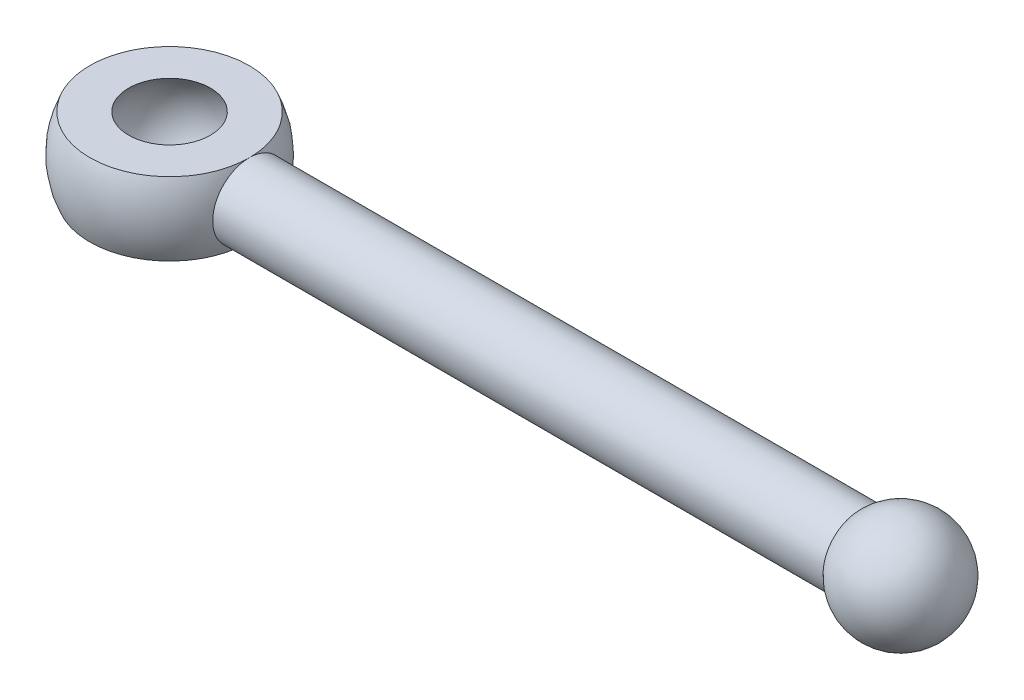
ISO-10303-21;
HEADER;
FILE_DESCRIPTION(('STEP AP214'),'2;1');
FILE_NAME('part.step','',(''),(''),'','','');
FILE_SCHEMA(('AUTOMOTIVE_DESIGN { 1 0 10303 214 1 1 1 1 }'));
ENDSEC;
DATA;
#1=APPLICATION_CONTEXT('core data for automotive mechanical design processes');
#2=APPLICATION_PROTOCOL_DEFINITION('international standard','automotive_design',2000,#1);
#3=PRODUCT_CONTEXT('',#1,'mechanical');
#4=PRODUCT('Part','Part','',(#3));
#5=PRODUCT_RELATED_PRODUCT_CATEGORY('part','',(#4));
#6=PRODUCT_DEFINITION_FORMATION('','',#4);
#7=PRODUCT_DEFINITION_CONTEXT('part definition',#1,'design');
#8=PRODUCT_DEFINITION('design','',#6,#7);
#9=PRODUCT_DEFINITION_SHAPE('','',#8);
#10=(LENGTH_UNIT() NAMED_UNIT(*) SI_UNIT(.MILLI.,.METRE.));
#11=(NAMED_UNIT(*) PLANE_ANGLE_UNIT() SI_UNIT($,.RADIAN.));
#12=(NAMED_UNIT(*) SI_UNIT($,.STERADIAN.) SOLID_ANGLE_UNIT());
#13=UNCERTAINTY_MEASURE_WITH_UNIT(LENGTH_MEASURE(1.E-05),#10,'distance_accuracy_value','');
#14=(GEOMETRIC_REPRESENTATION_CONTEXT(3) GLOBAL_UNCERTAINTY_ASSIGNED_CONTEXT((#13)) GLOBAL_UNIT_ASSIGNED_CONTEXT((#10,
#11,#12)) REPRESENTATION_CONTEXT('',''));
#15=CARTESIAN_POINT('',(0.,0.,0.));
#16=DIRECTION('',(0.,0.,1.));
#17=DIRECTION('',(1.,0.,0.));
#18=AXIS2_PLACEMENT_3D('',#15,#16,#17);
#19=CARTESIAN_POINT('',(-100.,0.,0.));
#20=DIRECTION('',(-1.,0.,0.));
#21=DIRECTION('',(0.,1.,0.));
#22=AXIS2_PLACEMENT_3D('',#19,#20,#21);
#23=SPHERICAL_SURFACE('',#22,24.);
#24=CARTESIAN_POINT('',(-78.1825757707286,0.,0.));
#25=DIRECTION('',(-1.,0.,0.));
#26=DIRECTION('',(0.,0.,1.));
#27=AXIS2_PLACEMENT_3D('',#24,#25,#26);
#28=CIRCLE('',#27,9.99999999999999);
#29=CARTESIAN_POINT('',(-78.1825757707286,-9.99999999999999,0.));
#30=VERTEX_POINT('',#29);
#31=CARTESIAN_POINT('',(-78.1825757707286,9.99999999999999,0.));
#32=VERTEX_POINT('',#31);
#33=EDGE_CURVE('E43',#30,#32,#28,.T.);
#34=ORIENTED_EDGE('',*,*,#33,.T.);
#35=CARTESIAN_POINT('',(-100.,9.99999999999998,0.));
#36=DIRECTION('',(0.,-1.,0.));
#37=DIRECTION('',(1.,0.,0.));
#38=AXIS2_PLACEMENT_3D('',#35,#36,#37);
#39=CIRCLE('',#38,21.8174242292714);
#40=EDGE_CURVE('E53',#32,#32,#39,.T.);
#41=ORIENTED_EDGE('',*,*,#40,.T.);
#42=EDGE_CURVE('E11',#32,#30,#28,.T.);
#43=ORIENTED_EDGE('',*,*,#42,.T.);
#44=CARTESIAN_POINT('',(-100.,-10.,0.));
#45=DIRECTION('',(0.,-1.,0.));
#46=DIRECTION('',(1.,0.,0.));
#47=AXIS2_PLACEMENT_3D('',#44,#45,#46);
#48=CIRCLE('',#47,21.8174242292714);
#49=EDGE_CURVE('E49',#30,#30,#48,.T.);
#50=ORIENTED_EDGE('',*,*,#49,.F.);
#51=EDGE_LOOP('',(#34,#41,#43,#50));
#52=FACE_BOUND('',#51,.T.);
#53=ADVANCED_FACE('F35',(#52),#23,.T.);
#54=CARTESIAN_POINT('',(100.,0.,0.));
#55=DIRECTION('',(-1.,0.,0.));
#56=DIRECTION('',(0.,1.,0.));
#57=AXIS2_PLACEMENT_3D('',#54,#55,#56);
#58=SPHERICAL_SURFACE('',#57,15.);
#59=CARTESIAN_POINT('',(88.8196601125011,0.,0.));
#60=DIRECTION('',(-1.,0.,0.));
#61=DIRECTION('',(0.,0.,1.));
#62=AXIS2_PLACEMENT_3D('',#59,#60,#61);
#63=CIRCLE('',#62,10.);
#64=CARTESIAN_POINT('',(88.8196601125011,0.,10.));
#65=VERTEX_POINT('',#64);
#66=EDGE_CURVE('E57',#65,#65,#63,.T.);
#67=ORIENTED_EDGE('',*,*,#66,.F.);
#68=EDGE_LOOP('',(#67));
#69=FACE_BOUND('',#68,.T.);
#70=ADVANCED_FACE('F79',(#69),#58,.T.);
#71=CARTESIAN_POINT('',(0.,0.,0.));
#72=DIRECTION('',(-1.,0.,0.));
#73=DIRECTION('',(0.,0.,1.));
#74=AXIS2_PLACEMENT_3D('',#71,#72,#73);
#75=CYLINDRICAL_SURFACE('',#74,10.);
#76=ORIENTED_EDGE('',*,*,#42,.F.);
#77=ORIENTED_EDGE('',*,*,#33,.F.);
#78=EDGE_LOOP('',(#76,#77));
#79=FACE_BOUND('',#78,.T.);
#80=ORIENTED_EDGE('',*,*,#66,.T.);
#81=EDGE_LOOP('',(#80));
#82=FACE_BOUND('',#81,.T.);
#83=ADVANCED_FACE('F83',(#79,#82),#75,.T.);
#84=CARTESIAN_POINT('',(-140.,-10.,-69.));
#85=DIRECTION('',(0.,-1.,0.));
#86=DIRECTION('',(1.,0.,0.));
#87=AXIS2_PLACEMENT_3D('',#84,#85,#86);
#88=PLANE('',#87);
#89=CARTESIAN_POINT('',(-100.,-10.,0.));
#90=DIRECTION('',(0.,-1.,0.));
#91=DIRECTION('',(1.,0.,0.));
#92=AXIS2_PLACEMENT_3D('',#89,#90,#91);
#93=CIRCLE('',#92,11.1803398874989);
#94=CARTESIAN_POINT('',(-88.8196601125011,-10.,0.));
#95=VERTEX_POINT('',#94);
#96=EDGE_CURVE('E63',#95,#95,#93,.F.);
#97=ORIENTED_EDGE('',*,*,#96,.T.);
#98=EDGE_LOOP('',(#97));
#99=FACE_BOUND('',#98,.T.);
#100=ORIENTED_EDGE('',*,*,#49,.T.);
#101=EDGE_LOOP('',(#100));
#102=FACE_BOUND('',#101,.T.);
#103=ADVANCED_FACE('F67',(#99,#102),#88,.T.);
#104=CARTESIAN_POINT('',(-140.,9.99999999999998,-69.));
#105=DIRECTION('',(0.,-1.,0.));
#106=DIRECTION('',(1.,0.,0.));
#107=AXIS2_PLACEMENT_3D('',#104,#105,#106);
#108=PLANE('',#107);
#109=CARTESIAN_POINT('',(-100.,9.99999999999998,0.));
#110=DIRECTION('',(0.,-1.,0.));
#111=DIRECTION('',(1.,0.,0.));
#112=AXIS2_PLACEMENT_3D('',#109,#110,#111);
#113=CIRCLE('',#112,11.180339887499);
#114=CARTESIAN_POINT('',(-88.819660112501,9.99999999999998,0.));
#115=VERTEX_POINT('',#114);
#116=EDGE_CURVE('E38',#115,#115,#113,.F.);
#117=ORIENTED_EDGE('',*,*,#116,.F.);
#118=EDGE_LOOP('',(#117));
#119=FACE_BOUND('',#118,.T.);
#120=ORIENTED_EDGE('',*,*,#40,.F.);
#121=EDGE_LOOP('',(#120));
#122=FACE_BOUND('',#121,.T.);
#123=ADVANCED_FACE('F54',(#119,#122),#108,.F.);
#124=CARTESIAN_POINT('',(-100.,0.,0.));
#125=DIRECTION('',(-1.,0.,0.));
#126=DIRECTION('',(0.,1.,0.));
#127=AXIS2_PLACEMENT_3D('',#124,#125,#126);
#128=SPHERICAL_SURFACE('',#127,15.);
#129=CARTESIAN_POINT('',(-100.,0.,0.));
#130=DIRECTION('',(0.,-1.,0.));
#131=DIRECTION('',(1.,0.,0.));
#132=AXIS2_PLACEMENT_3D('',#129,#130,#131);
#133=SPHERICAL_SURFACE('',#132,15.);
#134=ORIENTED_EDGE('',*,*,#116,.T.);
#135=EDGE_LOOP('',(#134));
#136=FACE_BOUND('',#135,.T.);
#137=ORIENTED_EDGE('',*,*,#96,.F.);
#138=EDGE_LOOP('',(#137));
#139=FACE_BOUND('',#138,.T.);
#140=ADVANCED_FACE('F69',(#136,#139),#133,.F.);
#141=CLOSED_SHELL('',(#53,#70,#83,#103,#123,#140));
#142=MANIFOLD_SOLID_BREP('B2',#141);
#143=ADVANCED_BREP_SHAPE_REPRESENTATION('',(#18,#142),#14);
#144=SHAPE_DEFINITION_REPRESENTATION(#9,#143);
ENDSEC;
END-ISO-10303-21;
